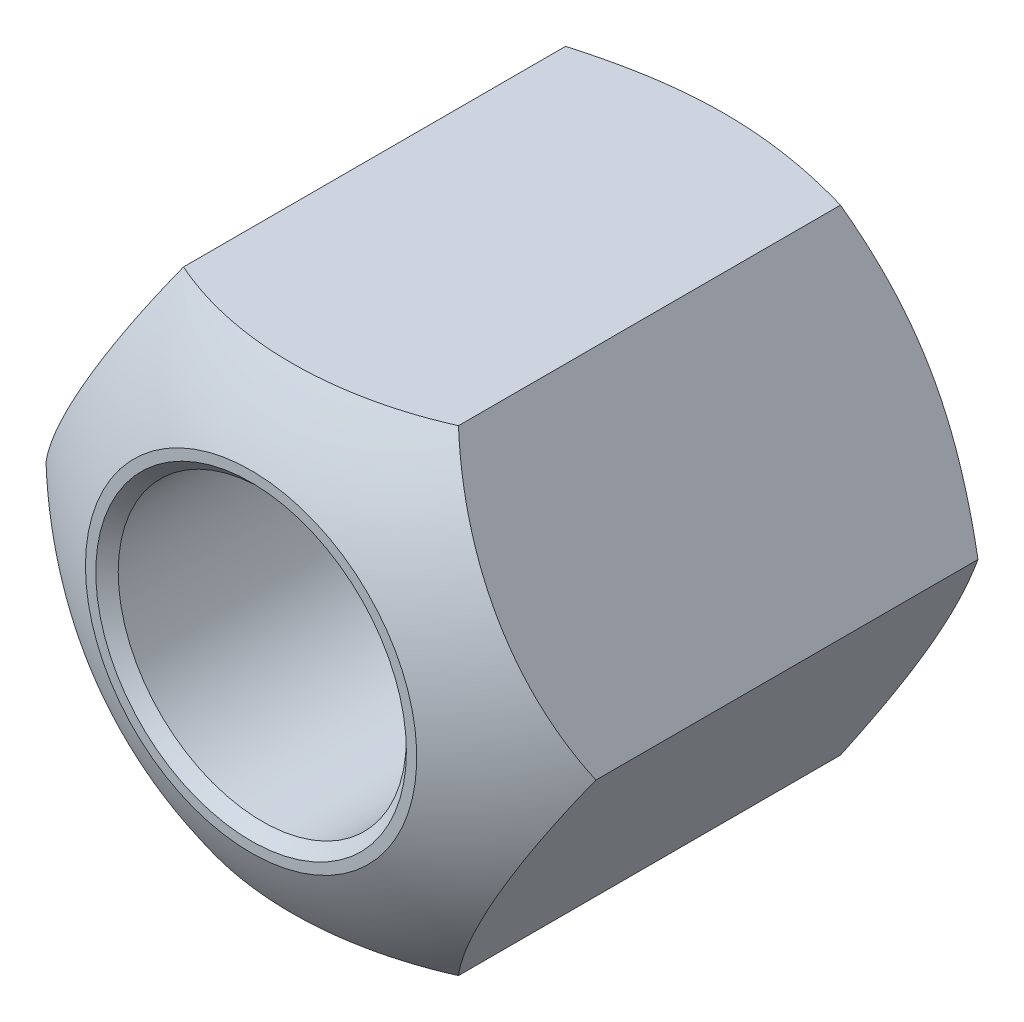
ISO-10303-21;
HEADER;
FILE_DESCRIPTION(('STEP AP214'),'2;1');
FILE_NAME('part.step','',(''),(''),'','','');
FILE_SCHEMA(('AUTOMOTIVE_DESIGN { 1 0 10303 214 1 1 1 1 }'));
ENDSEC;
DATA;
#1=APPLICATION_CONTEXT('core data for automotive mechanical design processes');
#2=APPLICATION_PROTOCOL_DEFINITION('international standard','automotive_design',2000,#1);
#3=PRODUCT_CONTEXT('',#1,'mechanical');
#4=PRODUCT('Part','Part','',(#3));
#5=PRODUCT_RELATED_PRODUCT_CATEGORY('part','',(#4));
#6=PRODUCT_DEFINITION_FORMATION('','',#4);
#7=PRODUCT_DEFINITION_CONTEXT('part definition',#1,'design');
#8=PRODUCT_DEFINITION('design','',#6,#7);
#9=PRODUCT_DEFINITION_SHAPE('','',#8);
#10=(LENGTH_UNIT() NAMED_UNIT(*) SI_UNIT(.MILLI.,.METRE.));
#11=(NAMED_UNIT(*) PLANE_ANGLE_UNIT() SI_UNIT($,.RADIAN.));
#12=(NAMED_UNIT(*) SI_UNIT($,.STERADIAN.) SOLID_ANGLE_UNIT());
#13=UNCERTAINTY_MEASURE_WITH_UNIT(LENGTH_MEASURE(1.E-05),#10,'distance_accuracy_value','');
#14=(GEOMETRIC_REPRESENTATION_CONTEXT(3) GLOBAL_UNCERTAINTY_ASSIGNED_CONTEXT((#13)) GLOBAL_UNIT_ASSIGNED_CONTEXT((#10,
#11,#12)) REPRESENTATION_CONTEXT('',''));
#15=CARTESIAN_POINT('',(0.,0.,0.));
#16=DIRECTION('',(0.,0.,1.));
#17=DIRECTION('',(1.,0.,0.));
#18=AXIS2_PLACEMENT_3D('',#15,#16,#17);
#19=CARTESIAN_POINT('',(-21.8115060802935,-0.688312552473345,-34.1728118765488));
#20=DIRECTION('',(0.,-1.,0.));
#21=DIRECTION('',(1.,0.,0.));
#22=AXIS2_PLACEMENT_3D('',#19,#20,#21);
#23=PLANE('',#22);
#24=CARTESIAN_POINT('',(-43.364174180659,-0.688312552473348,-20.5573968527933));
#25=CARTESIAN_POINT('',(-42.8652113743147,-0.688312552473348,-20.7977856170871));
#26=CARTESIAN_POINT('',(-42.365639392221,-0.688312552473348,-21.0369138297615));
#27=CARTESIAN_POINT('',(-41.3651505367829,-0.688312552473347,-21.5123537705534));
#28=CARTESIAN_POINT('',(-40.864233648564,-0.688312552473347,-21.748665467362));
#29=CARTESIAN_POINT('',(-39.8608547248779,-0.688312552473347,-22.2182113228665));
#30=CARTESIAN_POINT('',(-39.3583924425456,-0.688312552473347,-22.4514449546127));
#31=CARTESIAN_POINT('',(-38.3518723567875,-0.688312552473347,-22.9144375778677));
#32=CARTESIAN_POINT('',(-37.8478145574252,-0.688312552473347,-23.1441965782171));
#33=CARTESIAN_POINT('',(-36.3270820973135,-0.688312552473347,-23.8303672213714));
#34=CARTESIAN_POINT('',(-35.307742211604,-0.688312552473347,-24.2809036143607));
#35=CARTESIAN_POINT('',(-33.2606617087179,-0.688312552473346,-25.1623890799576));
#36=CARTESIAN_POINT('',(-32.2329215184432,-0.688312552473346,-25.5933391407261));
#37=CARTESIAN_POINT('',(-30.1378622822358,-0.688312552473346,-26.4424052095412));
#38=CARTESIAN_POINT('',(-29.0702508397684,-0.688312552473346,-26.8598037992115));
#39=CARTESIAN_POINT('',(-26.9222255315434,-0.688312552473345,-27.6609348711898));
#40=CARTESIAN_POINT('',(-25.8418102028342,-0.688312552473345,-28.0446634634901));
#41=CARTESIAN_POINT('',(-23.6688028539271,-0.688312552473345,-28.7677587165208));
#42=CARTESIAN_POINT('',(-22.5762435778769,-0.688312552473345,-29.1072229410037));
#43=CARTESIAN_POINT('',(-20.375378191733,-0.688312552473345,-29.730365540965));
#44=CARTESIAN_POINT('',(-19.2670774292805,-0.688312552473345,-30.0140623974526));
#45=CARTESIAN_POINT('',(-17.5956567621693,-0.688312552473345,-30.3863712928532));
#46=CARTESIAN_POINT('',(-17.0383765653784,-0.688312552473344,-30.5013876864848));
#47=CARTESIAN_POINT('',(-15.9201767824307,-0.688312552473344,-30.7122181626514));
#48=CARTESIAN_POINT('',(-15.3592572807741,-0.688312552473344,-30.8080326893949));
#49=CARTESIAN_POINT('',(-14.2342331896336,-0.688312552473344,-30.9787205891411));
#50=CARTESIAN_POINT('',(-13.6701286453774,-0.688312552473344,-31.0535942587462));
#51=CARTESIAN_POINT('',(-12.5393731276811,-0.688312552473344,-31.1808839300267));
#52=CARTESIAN_POINT('',(-11.972722153663,-0.688312552473344,-31.2332999266042));
#53=CARTESIAN_POINT('',(-10.8447196373537,-0.688312552473343,-31.3140153049642));
#54=CARTESIAN_POINT('',(-10.2833889333685,-0.688312552473343,-31.3426041626038));
#55=CARTESIAN_POINT('',(-9.16002537541743,-0.688312552473343,-31.3760947272865));
#56=CARTESIAN_POINT('',(-8.59799253245408,-0.688312552473343,-31.3809968009577));
#57=CARTESIAN_POINT('',(-7.47421005167185,-0.688312552473343,-31.3669977330455));
#58=CARTESIAN_POINT('',(-6.91246042029308,-0.688312552473343,-31.3480960726179));
#59=CARTESIAN_POINT('',(-5.79023043645902,-0.688312552473342,-31.2869327019772));
#60=CARTESIAN_POINT('',(-5.2297501428274,-0.688312552473342,-31.2446699305395));
#61=CARTESIAN_POINT('',(-3.85648688809357,-0.688312552473341,-31.1133597620753));
#62=CARTESIAN_POINT('',(-3.04488356588829,-0.688312552473342,-31.0117766250623));
#63=CARTESIAN_POINT('',(-1.42826125427573,-0.688312552473343,-30.7653708396185));
#64=CARTESIAN_POINT('',(-0.623243291699076,-0.688312552473342,-30.6205415752084));
#65=CARTESIAN_POINT('',(0.979633130866239,-0.688312552473342,-30.2927973904908));
#66=CARTESIAN_POINT('',(1.77748500014387,-0.688312552473342,-30.1098505417129));
#67=CARTESIAN_POINT('',(3.36492225633583,-0.688312552473342,-29.7113989462334));
#68=CARTESIAN_POINT('',(4.15450782311018,-0.688312552473341,-29.4958949094991));
#69=CARTESIAN_POINT('',(5.74256547663509,-0.688312552473341,-29.032483191192));
#70=CARTESIAN_POINT('',(6.54086159547079,-0.688312552473341,-28.7839765692017));
#71=CARTESIAN_POINT('',(8.12958725211722,-0.688312552473341,-28.2630985644782));
#72=CARTESIAN_POINT('',(8.92001673868503,-0.688312552473341,-27.9907270264031));
#73=CARTESIAN_POINT('',(10.4934330053447,-0.68831255247334,-27.4262835671693));
#74=CARTESIAN_POINT('',(11.2764225429129,-0.68831255247334,-27.1342192978254));
#75=CARTESIAN_POINT('',(12.8360355582879,-0.688312552473341,-26.5336475193339));
#76=CARTESIAN_POINT('',(13.6126590985965,-0.688312552473341,-26.2251401718491));
#77=CARTESIAN_POINT('',(15.3933886161045,-0.688312552473341,-25.4994542606817));
#78=CARTESIAN_POINT('',(16.3955579639846,-0.68831255247334,-25.0775314939519));
#79=CARTESIAN_POINT('',(18.3919715603131,-0.688312552473339,-24.2152868962896));
#80=CARTESIAN_POINT('',(19.3862154125716,-0.688312552473339,-23.7749641523388));
#81=CARTESIAN_POINT('',(21.3682028876162,-0.688312552473339,-22.8794878199226));
#82=CARTESIAN_POINT('',(22.3559452982677,-0.688312552473339,-22.4243315550405));
#83=CARTESIAN_POINT('',(24.3258051462865,-0.688312552473339,-21.5020748089487));
#84=CARTESIAN_POINT('',(25.3079226794759,-0.688312552473339,-21.0349745319555));
#85=CARTESIAN_POINT('',(27.2683573418649,-0.688312552473338,-20.0905475664461));
#86=CARTESIAN_POINT('',(28.2466700364004,-0.688312552473338,-19.6132116869644));
#87=CARTESIAN_POINT('',(30.199299364547,-0.688312552473338,-18.6504373400399));
#88=CARTESIAN_POINT('',(31.173615984367,-0.688312552473338,-18.1649988446628));
#89=CARTESIAN_POINT('',(33.1187502942094,-0.688312552473338,-17.1874153083342));
#90=CARTESIAN_POINT('',(34.0895683333116,-0.688312552473337,-16.6952709612984));
#91=CARTESIAN_POINT('',(36.0282942898574,-0.688312552473337,-15.7052923134865));
#92=CARTESIAN_POINT('',(36.9962022117053,-0.688312552473337,-15.2074580213271));
#93=CARTESIAN_POINT('',(39.7438970385037,-0.688312552473337,-13.7855551950312));
#94=CARTESIAN_POINT('',(41.5207050056149,-0.688312552473337,-12.8557299969641));
#95=CARTESIAN_POINT('',(45.0678914056553,-0.688312552473336,-10.9837994905329));
#96=CARTESIAN_POINT('',(46.8382696506688,-0.688312552473336,-10.0416938268934));
#97=CARTESIAN_POINT('',(50.3701704070157,-0.688312552473335,-8.15005058149527));
#98=CARTESIAN_POINT('',(52.1317037639952,-0.688312552473335,-7.20053323648602));
#99=CARTESIAN_POINT('',(54.7709486227348,-0.688312552473335,-5.77072284961265));
#100=CARTESIAN_POINT('',(55.650167434997,-0.688312552473335,-5.29320808868211));
#101=CARTESIAN_POINT('',(57.4076984563106,-0.688312552473334,-4.33651597056777));
#102=CARTESIAN_POINT('',(58.2860106666848,-0.688312552473334,-3.8573386158141));
#103=CARTESIAN_POINT('',(59.1639199338016,-0.688312552473334,-3.37742394748412));
#104=B_SPLINE_CURVE_WITH_KNOTS('',3,(#24,#25,#26,#27,#28,#29,#30,#31,#32,#33,#34,#35,#36,#37,
#38,#39,#40,#41,#42,#43,#44,#45,#46,#47,#48,#49,#50,#51,#52,#53,#54,#55,#56,#57,#58,#59,#60,#61,
#62,#63,#64,#65,#66,#67,#68,#69,#70,#71,#72,#73,#74,#75,#76,#77,#78,#79,#80,#81,#82,#83,#84,#85,
#86,#87,#88,#89,#90,#91,#92,#93,#94,#95,#96,#97,#98,#99,#100,#101,#102,#103),.UNSPECIFIED.,.F.,
.F.,(4,2,2,2,2,2,2,2,2,2,2,2,2,2,2,2,2,2,2,2,2,2,2,2,2,2,2,2,2,2,2,2,2,2,2,2,2,2,2,4),(0.,
1.66155281507719,3.32312408307869,4.98497620733311,6.64682410251409,9.99005360036441,
13.3331142394393,16.7715958375406,20.2104741733002,23.6416398713221,27.0716665752149,
28.7784655156213,30.4852249670629,32.1919602430643,33.8986959064849,35.5843810326371,
37.2700400673877,38.9557358446774,40.6415082043157,43.0939400081897,45.5467471880686,
48.0016172350933,50.4564337570437,52.9642283239922,55.4720392159312,57.9788812257284,
60.4856985936385,63.7475477982721,67.0095590505379,70.2721621629904,73.5347095292892,
76.800320503309,80.0659427380144,83.3312295772692,86.5965114721927,92.6126334432224,
98.6289298494208,104.632341948055,107.633909306331,110.635472279181),.UNSPECIFIED.);
#105=CARTESIAN_POINT('',(4.74660630242926,-0.688312552473373,-29.3228118765488));
#106=VERTEX_POINT('',#105);
#107=CARTESIAN_POINT('',(-21.8115060802935,-0.688312552473355,-29.3228118765488));
#108=VERTEX_POINT('',#107);
#109=EDGE_CURVE('E180',#106,#108,#104,.F.);
#110=ORIENTED_EDGE('',*,*,#109,.F.);
#111=DIRECTION('',(0.,0.,1.));
#112=VECTOR('',#111,1.);
#113=CARTESIAN_POINT('',(4.74660630242929,-0.688312552473341,-34.1728118765488));
#114=LINE('',#113,#112);
#115=CARTESIAN_POINT('',(4.74660630242929,-0.688312552473341,7.57756159603723));
#116=VERTEX_POINT('',#115);
#117=EDGE_CURVE('E39',#106,#116,#114,.T.);
#118=ORIENTED_EDGE('',*,*,#117,.T.);
#119=CARTESIAN_POINT('',(-8.53244988893209,-0.688312552473334,-22.3334174361955));
#120=DIRECTION('',(0.,-1.,0.));
#121=DIRECTION('',(1.,0.,0.));
#122=AXIS2_PLACEMENT_3D('',#119,#120,#121);
#123=CIRCLE('',#122,32.7261363439072);
#124=CARTESIAN_POINT('',(-21.8115060802935,-0.688312552473352,7.57756159603724));
#125=VERTEX_POINT('',#124);
#126=EDGE_CURVE('E97',#116,#125,#123,.T.);
#127=ORIENTED_EDGE('',*,*,#126,.T.);
#128=DIRECTION('',(0.,0.,1.));
#129=VECTOR('',#128,1.);
#130=CARTESIAN_POINT('',(-21.8115060802935,-0.688312552473345,-34.1728118765488));
#131=LINE('',#130,#129);
#132=EDGE_CURVE('E102',#108,#125,#131,.T.);
#133=ORIENTED_EDGE('',*,*,#132,.F.);
#134=EDGE_LOOP('',(#110,#118,#127,#133));
#135=FACE_BOUND('',#134,.T.);
#136=ADVANCED_FACE('F16',(#135),#23,.T.);
#137=CARTESIAN_POINT('',(-35.0905622716549,22.3116874475267,-34.1728118765488));
#138=DIRECTION('',(-0.866025403784438,-0.5,0.));
#139=DIRECTION('',(0.5,-0.866025403784439,0.));
#140=AXIS2_PLACEMENT_3D('',#137,#138,#139);
#141=PLANE('',#140);
#142=CARTESIAN_POINT('',(-21.8113906102397,-0.688512552473344,-29.3227452094473));
#143=CARTESIAN_POINT('',(-22.1032585280075,-0.182982489800128,-29.4912430266369));
#144=CARTESIAN_POINT('',(-22.3962648860752,0.324519409313961,-29.6520946268264));
#145=CARTESIAN_POINT('',(-22.9846271619718,1.34359276442373,-29.9563800253422));
#146=CARTESIAN_POINT('',(-23.279983818727,1.85516550027727,-30.0998080950021));
#147=CARTESIAN_POINT('',(-23.8736238120387,2.88338013009803,-30.3673212930186));
#148=CARTESIAN_POINT('',(-24.1719123908864,3.40003110397977,-30.4913602292878));
#149=CARTESIAN_POINT('',(-24.7705495565162,4.43690109014963,-30.717423075732));
#150=CARTESIAN_POINT('',(-25.0708979350049,4.95711974166299,-30.8194491790077));
#151=CARTESIAN_POINT('',(-25.6659775460291,5.98782786250525,-30.9971555015905));
#152=CARTESIAN_POINT('',(-25.9606646384466,6.498240878907,-31.0734233954765));
#153=CARTESIAN_POINT('',(-26.5513891024217,7.5214056637859,-31.2013072654084));
#154=CARTESIAN_POINT('',(-26.8474264998602,8.03415747708978,-31.2529227669311));
#155=CARTESIAN_POINT('',(-27.4399985814096,9.06052242948013,-31.3301985865952));
#156=CARTESIAN_POINT('',(-27.7365322531997,9.57413381517565,-31.3558897469131));
#157=CARTESIAN_POINT('',(-28.329873244251,10.6018305578897,-31.3807644018782));
#158=CARTESIAN_POINT('',(-28.6266805547727,11.1159158997711,-31.3799487156378));
#159=CARTESIAN_POINT('',(-29.1815667256381,12.0770069401274,-31.3536610461216));
#160=CARTESIAN_POINT('',(-29.4396851053547,12.5240810881638,-31.3313946122529));
#161=CARTESIAN_POINT('',(-29.9553056409861,13.4171620533033,-31.2672373268912));
#162=CARTESIAN_POINT('',(-30.2128078056739,13.8631688856016,-31.2253467564764));
#163=CARTESIAN_POINT('',(-30.7271007720538,14.753950433347,-31.1226672065899));
#164=CARTESIAN_POINT('',(-30.9838907177758,15.1987236662103,-31.0618611378166));
#165=CARTESIAN_POINT('',(-31.496241053083,16.0861404782373,-30.9224267569259));
#166=CARTESIAN_POINT('',(-31.7518014478731,16.528784066416,-30.8437985203198));
#167=CARTESIAN_POINT('',(-32.527628386363,17.8725557417612,-30.5791626851964));
#168=CARTESIAN_POINT('',(-33.045690666378,18.7698659322322,-30.3667535262186));
#169=CARTESIAN_POINT('',(-33.8170628620437,20.1059217666712,-30.0051368981283));
#170=CARTESIAN_POINT('',(-34.0730123539674,20.5492392908543,-29.8775610005275));
#171=CARTESIAN_POINT('',(-34.5831409701095,21.4328079724074,-29.6094937184256));
#172=CARTESIAN_POINT('',(-34.8373205717077,21.8730599566231,-29.4690059741789));
#173=CARTESIAN_POINT('',(-35.0906777417087,22.3118874475267,-29.3227452094473));
#174=B_SPLINE_CURVE_WITH_KNOTS('',3,(#142,#143,#144,#145,#146,#147,#148,#149,#150,#151,#152,
#153,#154,#155,#156,#157,#158,#159,#160,#161,#162,#163,#164,#165,#166,#167,#168,#169,#170,#171,
#172,#173),.UNSPECIFIED.,.F.,.F.,(4,2,2,2,2,2,2,2,2,2,2,2,2,2,2,4),(0.,1.82275209583971,
3.64610187987773,5.47373144334343,7.30117883905958,9.08355891739022,10.8659733025976,
12.6462646412199,14.4265009654718,15.9762768881921,17.5260306140232,19.0771885590146,
20.6283399319781,23.7989683744784,25.381520854309,26.9636285236953),.UNSPECIFIED.);
#175=CARTESIAN_POINT('',(-35.0905622716549,22.3116874475267,-29.3228118765488));
#176=VERTEX_POINT('',#175);
#177=EDGE_CURVE('E172',#108,#176,#174,.T.);
#178=ORIENTED_EDGE('',*,*,#177,.F.);
#179=ORIENTED_EDGE('',*,*,#132,.T.);
#180=CARTESIAN_POINT('',(-28.4510341759742,10.8116874475266,-22.3334174361955));
#181=DIRECTION('',(-0.866025403784438,-0.5,0.));
#182=DIRECTION('',(0.5,-0.866025403784439,0.));
#183=AXIS2_PLACEMENT_3D('',#180,#181,#182);
#184=CIRCLE('',#183,32.7261363439071);
#185=CARTESIAN_POINT('',(-35.0905622716549,22.3116874475267,7.57756159603724));
#186=VERTEX_POINT('',#185);
#187=EDGE_CURVE('E225',#125,#186,#184,.T.);
#188=ORIENTED_EDGE('',*,*,#187,.T.);
#189=DIRECTION('',(0.,0.,1.));
#190=VECTOR('',#189,1.);
#191=CARTESIAN_POINT('',(-35.0905622716549,22.3116874475267,-34.1728118765488));
#192=LINE('',#191,#190);
#193=EDGE_CURVE('E91',#176,#186,#192,.T.);
#194=ORIENTED_EDGE('',*,*,#193,.F.);
#195=EDGE_LOOP('',(#178,#179,#188,#194));
#196=FACE_BOUND('',#195,.T.);
#197=ADVANCED_FACE('F182',(#196),#141,.T.);
#198=CARTESIAN_POINT('',(-21.8115060802935,45.3116874475267,-34.1728118765488));
#199=DIRECTION('',(-0.866025403784439,0.5,0.));
#200=DIRECTION('',(-0.5,-0.866025403784439,0.));
#201=AXIS2_PLACEMENT_3D('',#198,#199,#200);
#202=PLANE('',#201);
#203=CARTESIAN_POINT('',(-35.0906777417087,22.3114874475267,-29.3227452094473));
#204=CARTESIAN_POINT('',(-34.7988098239409,22.8170175101999,-29.4912430266369));
#205=CARTESIAN_POINT('',(-34.5058034658731,23.324519409314,-29.6520946268264));
#206=CARTESIAN_POINT('',(-33.9174411899765,24.3435927644237,-29.9563800253422));
#207=CARTESIAN_POINT('',(-33.6220845332214,24.8551655002773,-30.0998080950021));
#208=CARTESIAN_POINT('',(-33.0284445399097,25.883380130098,-30.3673212930186));
#209=CARTESIAN_POINT('',(-32.730155961062,26.4000311039798,-30.4913602292878));
#210=CARTESIAN_POINT('',(-32.1315187954322,27.4369010901496,-30.717423075732));
#211=CARTESIAN_POINT('',(-31.8311704169435,27.957119741663,-30.8194491790077));
#212=CARTESIAN_POINT('',(-31.2360908059193,28.9878278625053,-30.9971555015905));
#213=CARTESIAN_POINT('',(-30.9414037135018,29.498240878907,-31.0734233954765));
#214=CARTESIAN_POINT('',(-30.3506792495266,30.5214056637859,-31.2013072654084));
#215=CARTESIAN_POINT('',(-30.0546418520882,31.0341574770898,-31.2529227669311));
#216=CARTESIAN_POINT('',(-29.4620697705388,32.0605224294801,-31.3301985865952));
#217=CARTESIAN_POINT('',(-29.1655360987486,32.5741338151756,-31.3558897469131));
#218=CARTESIAN_POINT('',(-28.5721951076974,33.6018305578897,-31.3807644018782));
#219=CARTESIAN_POINT('',(-28.2753877971757,34.1159158997711,-31.3799487156378));
#220=CARTESIAN_POINT('',(-27.7205016263103,35.0770069401274,-31.3536610461216));
#221=CARTESIAN_POINT('',(-27.4623832465937,35.5240810881638,-31.3313946122529));
#222=CARTESIAN_POINT('',(-26.9467627109623,36.4171620533033,-31.2672373268912));
#223=CARTESIAN_POINT('',(-26.6892605462745,36.8631688856016,-31.2253467564764));
#224=CARTESIAN_POINT('',(-26.1749675798945,37.753950433347,-31.1226672065899));
#225=CARTESIAN_POINT('',(-25.9181776341726,38.1987236662103,-31.0618611378166));
#226=CARTESIAN_POINT('',(-25.4058272988654,39.0861404782373,-30.9224267569259));
#227=CARTESIAN_POINT('',(-25.1502669040753,39.528784066416,-30.8437985203198));
#228=CARTESIAN_POINT('',(-24.3744399655854,40.8725557417612,-30.5791626851964));
#229=CARTESIAN_POINT('',(-23.8563776855703,41.7698659322322,-30.3667535262186));
#230=CARTESIAN_POINT('',(-23.0850054899046,43.1059217666712,-30.0051368981283));
#231=CARTESIAN_POINT('',(-22.829055997981,43.5492392908543,-29.8775610005275));
#232=CARTESIAN_POINT('',(-22.3189273818389,44.4328079724073,-29.6094937184256));
#233=CARTESIAN_POINT('',(-22.0647477802406,44.8730599566231,-29.4690059741789));
#234=CARTESIAN_POINT('',(-21.8113906102397,45.3118874475267,-29.3227452094473));
#235=B_SPLINE_CURVE_WITH_KNOTS('',3,(#203,#204,#205,#206,#207,#208,#209,#210,#211,#212,#213,
#214,#215,#216,#217,#218,#219,#220,#221,#222,#223,#224,#225,#226,#227,#228,#229,#230,#231,#232,
#233,#234),.UNSPECIFIED.,.F.,.F.,(4,2,2,2,2,2,2,2,2,2,2,2,2,2,2,4),(0.,1.82275209583971,
3.64610187987774,5.47373144334343,7.30117883905958,9.08355891739021,10.8659733025976,
12.6462646412199,14.4265009654718,15.9762768881921,17.5260306140232,19.0771885590146,
20.6283399319781,23.7989683744784,25.381520854309,26.9636285236953),.UNSPECIFIED.);
#236=CARTESIAN_POINT('',(-21.8115060802935,45.3116874475266,-29.3228118765488));
#237=VERTEX_POINT('',#236);
#238=EDGE_CURVE('E73',#176,#237,#235,.T.);
#239=ORIENTED_EDGE('',*,*,#238,.F.);
#240=ORIENTED_EDGE('',*,*,#193,.T.);
#241=CARTESIAN_POINT('',(-28.4510341759742,33.8116874475267,-22.3334174361955));
#242=DIRECTION('',(-0.866025403784439,0.5,0.));
#243=DIRECTION('',(-0.5,-0.866025403784439,0.));
#244=AXIS2_PLACEMENT_3D('',#241,#242,#243);
#245=CIRCLE('',#244,32.7261363439071);
#246=CARTESIAN_POINT('',(-21.8115060802935,45.3116874475266,7.57756159603724));
#247=VERTEX_POINT('',#246);
#248=EDGE_CURVE('E218',#186,#247,#245,.T.);
#249=ORIENTED_EDGE('',*,*,#248,.T.);
#250=DIRECTION('',(0.,0.,1.));
#251=VECTOR('',#250,1.);
#252=CARTESIAN_POINT('',(-21.8115060802935,45.3116874475267,-34.1728118765488));
#253=LINE('',#252,#251);
#254=EDGE_CURVE('E93',#237,#247,#253,.T.);
#255=ORIENTED_EDGE('',*,*,#254,.F.);
#256=EDGE_LOOP('',(#239,#240,#249,#255));
#257=FACE_BOUND('',#256,.T.);
#258=ADVANCED_FACE('F187',(#257),#202,.T.);
#259=CARTESIAN_POINT('',(4.74660630242929,45.3116874475267,-34.1728118765488));
#260=DIRECTION('',(0.,1.,0.));
#261=DIRECTION('',(0.,0.,1.));
#262=AXIS2_PLACEMENT_3D('',#259,#260,#261);
#263=PLANE('',#262);
#264=CARTESIAN_POINT('',(-43.3641741798055,45.3116874475267,-20.5573968532045));
#265=CARTESIAN_POINT('',(-42.8652113734755,45.3116874475267,-20.7977856174896));
#266=CARTESIAN_POINT('',(-42.3656393913961,45.3116874475267,-21.0369138301554));
#267=CARTESIAN_POINT('',(-41.3651505359867,45.3116874475267,-21.51235377093));
#268=CARTESIAN_POINT('',(-40.864233647782,45.3116874475267,-21.7486654677299));
#269=CARTESIAN_POINT('',(-39.8608547241247,45.3116874475267,-22.218211323217));
#270=CARTESIAN_POINT('',(-39.3583924418067,45.3116874475267,-22.4514449549547));
#271=CARTESIAN_POINT('',(-38.3518723560773,45.3116874475267,-22.9144375781923));
#272=CARTESIAN_POINT('',(-37.8478145567294,45.3116874475267,-23.1441965785331));
#273=CARTESIAN_POINT('',(-36.3270820966613,45.3116874475267,-23.8303672216615));
#274=CARTESIAN_POINT('',(-35.3077422109809,45.3116874475267,-24.2809036146335));
#275=CARTESIAN_POINT('',(-33.2606617081535,45.3116874475267,-25.1623890801961));
#276=CARTESIAN_POINT('',(-32.2329215179082,45.3116874475267,-25.5933391409476));
#277=CARTESIAN_POINT('',(-30.1378622817616,45.3116874475267,-26.4424052097285));
#278=CARTESIAN_POINT('',(-29.0702508393254,45.3116874475267,-26.8598037993817));
#279=CARTESIAN_POINT('',(-26.9222255311635,45.3116874475267,-27.6609348713266));
#280=CARTESIAN_POINT('',(-25.8418102024861,45.3116874475267,-28.0446634636107));
#281=CARTESIAN_POINT('',(-23.6688028536432,45.3116874475267,-28.7677587166106));
#282=CARTESIAN_POINT('',(-22.5762435776255,45.3116874475267,-29.1072229410789));
#283=CARTESIAN_POINT('',(-20.3753781915473,45.3116874475267,-29.7303655410136));
#284=CARTESIAN_POINT('',(-19.2670774291281,45.3116874475267,-30.0140623974891));
#285=CARTESIAN_POINT('',(-17.5956567620763,45.3116874475267,-30.3863712928727));
#286=CARTESIAN_POINT('',(-17.038376565311,45.3116874475267,-30.501387686498));
#287=CARTESIAN_POINT('',(-15.920176782415,45.3116874475267,-30.7122181626539));
#288=CARTESIAN_POINT('',(-15.3592572807844,45.3116874475267,-30.8080326893929));
#289=CARTESIAN_POINT('',(-14.2342331896962,45.3116874475267,-30.9787205891321));
#290=CARTESIAN_POINT('',(-13.6701286454663,45.3116874475267,-31.0535942587347));
#291=CARTESIAN_POINT('',(-12.5393731278227,45.3116874475267,-31.1808839300123));
#292=CARTESIAN_POINT('',(-11.9727221538311,45.3116874475267,-31.2332999265895));
#293=CARTESIAN_POINT('',(-10.8447196375742,45.3116874475267,-31.3140153049511));
#294=CARTESIAN_POINT('',(-10.2833889336149,45.3116874475267,-31.3426041625926));
#295=CARTESIAN_POINT('',(-9.16002537571558,45.3116874475267,-31.3760947272815));
#296=CARTESIAN_POINT('',(-8.59799253277806,45.3116874475267,-31.3809968009568));
#297=CARTESIAN_POINT('',(-7.47421005204728,45.3116874475267,-31.366997733055));
#298=CARTESIAN_POINT('',(-6.91246042069412,45.3116874475267,-31.3480960726338));
#299=CARTESIAN_POINT('',(-5.79023043691093,45.3116874475267,-31.2869327020077));
#300=CARTESIAN_POINT('',(-5.22975014330457,45.3116874475267,-31.2446699305784));
#301=CARTESIAN_POINT('',(-3.85648688861155,45.3116874475267,-31.1133597621347));
#302=CARTESIAN_POINT('',(-3.04488356642171,45.3116874475267,-31.0117766251336));
#303=CARTESIAN_POINT('',(-1.42826125483938,45.3116874475267,-30.7653708397144));
#304=CARTESIAN_POINT('',(-0.623243292277516,45.3116874475267,-30.6205415753169));
#305=CARTESIAN_POINT('',(0.9796331302587,45.3116874475267,-30.2927973906248));
#306=CARTESIAN_POINT('',(1.77748499952203,45.3116874475267,-30.1098505418598));
#307=CARTESIAN_POINT('',(3.36492225568575,45.3116874475267,-29.7113989464059));
#308=CARTESIAN_POINT('',(4.15450782244615,45.3116874475267,-29.4958949096843));
#309=CARTESIAN_POINT('',(5.74256547594284,45.3116874475267,-29.0324831914027));
#310=CARTESIAN_POINT('',(6.54086159476426,45.3116874475267,-28.7839765694253));
#311=CARTESIAN_POINT('',(8.12958725138228,45.3116874475267,-28.2630985647272));
#312=CARTESIAN_POINT('',(8.92001673793595,45.3116874475267,-27.9907270266646));
#313=CARTESIAN_POINT('',(10.4934330045675,45.3116874475267,-27.4262835674554));
#314=CARTESIAN_POINT('',(11.2764225421216,45.3116874475267,-27.1342192981236));
#315=CARTESIAN_POINT('',(12.8360355574684,45.3116874475267,-26.5336475196559));
#316=CARTESIAN_POINT('',(13.6126590977629,45.3116874475267,-26.2251401721829));
#317=CARTESIAN_POINT('',(15.3933886152607,45.3116874475267,-25.4994542610332));
#318=CARTESIAN_POINT('',(16.3955579631444,45.3116874475267,-25.0775314943086));
#319=CARTESIAN_POINT('',(18.3919715594796,45.3116874475267,-24.2152868966557));
#320=CARTESIAN_POINT('',(19.3862154117413,45.3116874475267,-23.7749641527089));
#321=CARTESIAN_POINT('',(21.3682028867919,45.3116874475267,-22.8794878203));
#322=CARTESIAN_POINT('',(22.3559452974463,45.3116874475267,-22.424331555421));
#323=CARTESIAN_POINT('',(24.3258051454705,45.3116874475267,-21.5020748093348));
#324=CARTESIAN_POINT('',(25.3079226786625,45.3116874475267,-21.034974532344));
#325=CARTESIAN_POINT('',(27.2683573410565,45.3116874475267,-20.0905475668388));
#326=CARTESIAN_POINT('',(28.2466700355945,45.3116874475267,-19.613211687359));
#327=CARTESIAN_POINT('',(30.1992993637458,45.3116874475267,-18.6504373404377));
#328=CARTESIAN_POINT('',(31.173615983568,45.3116874475267,-18.164998845062));
#329=CARTESIAN_POINT('',(33.1187502934147,45.3116874475267,-17.1874153087359));
#330=CARTESIAN_POINT('',(34.089568332519,45.3116874475267,-16.6952709617012));
#331=CARTESIAN_POINT('',(36.0282942890689,45.3116874475267,-15.7052923138911));
#332=CARTESIAN_POINT('',(36.9962022109186,45.3116874475267,-15.2074580217326));
#333=CARTESIAN_POINT('',(39.7438970377195,45.3116874475267,-13.78555519544));
#334=CARTESIAN_POINT('',(41.5207050048312,45.3116874475267,-12.8557299973753));
#335=CARTESIAN_POINT('',(45.0678914048722,45.3116874475267,-10.9837994909485));
#336=CARTESIAN_POINT('',(46.8382696498859,45.3116874475267,-10.0416938273109));
#337=CARTESIAN_POINT('',(50.3701704062325,45.3116874475267,-8.15005058191652));
#338=CARTESIAN_POINT('',(52.1317037632117,45.3116874475267,-7.20053323690908));
#339=CARTESIAN_POINT('',(54.7709486219506,45.3116874475267,-5.77072285003822));
#340=CARTESIAN_POINT('',(55.6501674342125,45.3116874475267,-5.29320808910849));
#341=CARTESIAN_POINT('',(57.4076984555256,45.3116874475267,-4.33651597099571));
#342=CARTESIAN_POINT('',(58.2860106658995,45.3116874475267,-3.85733861624281));
#343=CARTESIAN_POINT('',(59.163919933016,45.3116874475267,-3.37742394791358));
#344=B_SPLINE_CURVE_WITH_KNOTS('',3,(#264,#265,#266,#267,#268,#269,#270,#271,#272,#273,#274,
#275,#276,#277,#278,#279,#280,#281,#282,#283,#284,#285,#286,#287,#288,#289,#290,#291,#292,#293,
#294,#295,#296,#297,#298,#299,#300,#301,#302,#303,#304,#305,#306,#307,#308,#309,#310,#311,#312,
#313,#314,#315,#316,#317,#318,#319,#320,#321,#322,#323,#324,#325,#326,#327,#328,#329,#330,#331,
#332,#333,#334,#335,#336,#337,#338,#339,#340,#341,#342,#343),.UNSPECIFIED.,.F.,.F.,(4,2,2,2,2,2,
2,2,2,2,2,2,2,2,2,2,2,2,2,2,2,2,2,2,2,2,2,2,2,2,2,2,2,2,2,2,2,2,2,4),(0.,1.66155281502723,
3.32312408297878,4.98497620718323,6.64682410231425,9.99005360006343,13.3331142390372,
16.7715958370323,20.2104741726857,23.6416398706019,27.071666574389,28.7784655147162,
30.4852249660787,32.191960242001,33.8986959053425,35.5843810314174,37.2700400660907,
38.955735843303,40.6415082028639,43.0939400066876,45.5467471865162,48.0016172334903,
50.4564337553903,52.9642283222865,55.4720392141731,57.9788812239181,60.485698591776,
63.7475477964133,67.0095590486829,70.2721621611391,73.5347095274418,76.8003205014658,
80.0659427361753,83.3312295754342,86.5965114703618,92.6126334413893,98.6289298475855,
104.632341946216,107.63390930449,110.635472277339),.UNSPECIFIED.);
#345=CARTESIAN_POINT('',(4.74660630242929,45.3116874475267,-29.3228118765488));
#346=VERTEX_POINT('',#345);
#347=EDGE_CURVE('E68',#237,#346,#344,.T.);
#348=ORIENTED_EDGE('',*,*,#347,.F.);
#349=ORIENTED_EDGE('',*,*,#254,.T.);
#350=CARTESIAN_POINT('',(-8.53244988893209,45.3116874475266,-22.3334174361955));
#351=DIRECTION('',(0.,1.,0.));
#352=DIRECTION('',(0.,0.,1.));
#353=AXIS2_PLACEMENT_3D('',#350,#351,#352);
#354=CIRCLE('',#353,32.7261363439072);
#355=CARTESIAN_POINT('',(4.74660630242929,45.3116874475267,7.57756159603724));
#356=VERTEX_POINT('',#355);
#357=EDGE_CURVE('E89',#247,#356,#354,.T.);
#358=ORIENTED_EDGE('',*,*,#357,.T.);
#359=DIRECTION('',(0.,0.,1.));
#360=VECTOR('',#359,1.);
#361=CARTESIAN_POINT('',(4.74660630242929,45.3116874475267,-34.1728118765488));
#362=LINE('',#361,#360);
#363=EDGE_CURVE('E85',#346,#356,#362,.T.);
#364=ORIENTED_EDGE('',*,*,#363,.F.);
#365=EDGE_LOOP('',(#348,#349,#358,#364));
#366=FACE_BOUND('',#365,.T.);
#367=ADVANCED_FACE('F86',(#366),#263,.T.);
#368=CARTESIAN_POINT('',(18.0256624937907,22.3116874475267,-34.1728118765488));
#369=DIRECTION('',(0.866025403784438,0.5,0.));
#370=DIRECTION('',(-0.5,0.866025403784438,0.));
#371=AXIS2_PLACEMENT_3D('',#368,#369,#370);
#372=PLANE('',#371);
#373=CARTESIAN_POINT('',(4.74649083237545,45.3118874475267,-29.3227452094473));
#374=CARTESIAN_POINT('',(5.03835875014328,44.8063573848534,-29.4912430266369));
#375=CARTESIAN_POINT('',(5.33136510821105,44.2988554857394,-29.6520946268264));
#376=CARTESIAN_POINT('',(5.91972738410765,43.2797821306296,-29.9563800253422));
#377=CARTESIAN_POINT('',(6.21508404086277,42.768209394776,-30.0998080950021));
#378=CARTESIAN_POINT('',(6.80872403417449,41.7399947649553,-30.3673212930186));
#379=CARTESIAN_POINT('',(7.1070126130222,41.2233437910735,-30.4913602292878));
#380=CARTESIAN_POINT('',(7.70564977865201,40.1864738049037,-30.717423075732));
#381=CARTESIAN_POINT('',(8.00599815714072,39.6662551533903,-30.8194491790077));
#382=CARTESIAN_POINT('',(8.60107776816493,38.6355470325481,-30.9971555015905));
#383=CARTESIAN_POINT('',(8.89576486058236,38.1251340161463,-31.0734233954765));
#384=CARTESIAN_POINT('',(9.48648932455754,37.1019692312674,-31.2013072654084));
#385=CARTESIAN_POINT('',(9.78252672199601,36.5892174179635,-31.2529227669311));
#386=CARTESIAN_POINT('',(10.3750988035454,35.5628524655732,-31.3301985865952));
#387=CARTESIAN_POINT('',(10.6716324753355,35.0492410798777,-31.3558897469131));
#388=CARTESIAN_POINT('',(11.2649734663868,34.0215443371636,-31.3807644018782));
#389=CARTESIAN_POINT('',(11.5617807769085,33.5074589952822,-31.3799487156378));
#390=CARTESIAN_POINT('',(12.1166669477739,32.5463679549259,-31.3536610461216));
#391=CARTESIAN_POINT('',(12.3747853274905,32.0992938068895,-31.3313946122529));
#392=CARTESIAN_POINT('',(12.8904058631219,31.20621284175,-31.2672373268912));
#393=CARTESIAN_POINT('',(13.1479080278097,30.7602060094517,-31.2253467564764));
#394=CARTESIAN_POINT('',(13.6622009941896,29.8694244617064,-31.1226672065899));
#395=CARTESIAN_POINT('',(13.9189909399116,29.4246512288431,-31.0618611378166));
#396=CARTESIAN_POINT('',(14.4313412752188,28.537234416816,-30.9224267569259));
#397=CARTESIAN_POINT('',(14.6869016700089,28.0945908286373,-30.8437985203198));
#398=CARTESIAN_POINT('',(15.4627286084988,26.7508191532921,-30.5791626851964));
#399=CARTESIAN_POINT('',(15.9807908885138,25.8535089628211,-30.3667535262186));
#400=CARTESIAN_POINT('',(16.7521630841796,24.5174531283821,-30.0051368981283));
#401=CARTESIAN_POINT('',(17.0081125761032,24.074135604199,-29.8775610005275));
#402=CARTESIAN_POINT('',(17.5182411922453,23.190566922646,-29.6094937184256));
#403=CARTESIAN_POINT('',(17.7724207938435,22.7503149384303,-29.4690059741789));
#404=CARTESIAN_POINT('',(18.0257779638445,22.3114874475267,-29.3227452094473));
#405=B_SPLINE_CURVE_WITH_KNOTS('',3,(#373,#374,#375,#376,#377,#378,#379,#380,#381,#382,#383,
#384,#385,#386,#387,#388,#389,#390,#391,#392,#393,#394,#395,#396,#397,#398,#399,#400,#401,#402,
#403,#404),.UNSPECIFIED.,.F.,.F.,(4,2,2,2,2,2,2,2,2,2,2,2,2,2,2,4),(0.,1.82275209583971,
3.64610187987773,5.47373144334344,7.30117883905958,9.08355891739021,10.8659733025976,
12.6462646412199,14.4265009654718,15.9762768881921,17.5260306140232,19.0771885590146,
20.6283399319781,23.7989683744784,25.381520854309,26.9636285236953),.UNSPECIFIED.);
#406=CARTESIAN_POINT('',(18.0256624937907,22.3116874475267,-29.3228118765488));
#407=VERTEX_POINT('',#406);
#408=EDGE_CURVE('E33',#346,#407,#405,.T.);
#409=ORIENTED_EDGE('',*,*,#408,.F.);
#410=ORIENTED_EDGE('',*,*,#363,.T.);
#411=CARTESIAN_POINT('',(11.38613439811,33.8116874475267,-22.3334174361955));
#412=DIRECTION('',(0.866025403784438,0.5,0.));
#413=DIRECTION('',(-0.5,0.866025403784438,0.));
#414=AXIS2_PLACEMENT_3D('',#411,#412,#413);
#415=CIRCLE('',#414,32.7261363439071);
#416=CARTESIAN_POINT('',(18.0256624937907,22.3116874475267,7.57756159603724));
#417=VERTEX_POINT('',#416);
#418=EDGE_CURVE('E213',#356,#417,#415,.T.);
#419=ORIENTED_EDGE('',*,*,#418,.T.);
#420=DIRECTION('',(0.,0.,1.));
#421=VECTOR('',#420,1.);
#422=CARTESIAN_POINT('',(18.0256624937907,22.3116874475267,-34.1728118765488));
#423=LINE('',#422,#421);
#424=EDGE_CURVE('E81',#407,#417,#423,.T.);
#425=ORIENTED_EDGE('',*,*,#424,.F.);
#426=EDGE_LOOP('',(#409,#410,#419,#425));
#427=FACE_BOUND('',#426,.T.);
#428=ADVANCED_FACE('F79',(#427),#372,.T.);
#429=CARTESIAN_POINT('',(4.74660630242929,-0.688312552473341,-34.1728118765488));
#430=DIRECTION('',(0.866025403784439,-0.5,0.));
#431=DIRECTION('',(0.5,0.866025403784439,0.));
#432=AXIS2_PLACEMENT_3D('',#429,#430,#431);
#433=PLANE('',#432);
#434=CARTESIAN_POINT('',(18.0257779638445,22.3118874475267,-29.3227452094473));
#435=CARTESIAN_POINT('',(17.7339100460767,21.8063573848534,-29.4912430266369));
#436=CARTESIAN_POINT('',(17.4409036880089,21.2988554857394,-29.6520946268264));
#437=CARTESIAN_POINT('',(16.8525414121123,20.2797821306296,-29.9563800253422));
#438=CARTESIAN_POINT('',(16.5571847553572,19.768209394776,-30.0998080950021));
#439=CARTESIAN_POINT('',(15.9635447620455,18.7399947649553,-30.3673212930187));
#440=CARTESIAN_POINT('',(15.6652561831978,18.2233437910735,-30.4913602292878));
#441=CARTESIAN_POINT('',(15.066619017568,17.1864738049037,-30.717423075732));
#442=CARTESIAN_POINT('',(14.7662706390793,16.6662551533903,-30.8194491790077));
#443=CARTESIAN_POINT('',(14.1711910280551,15.6355470325481,-30.9971555015905));
#444=CARTESIAN_POINT('',(13.8765039356376,15.1251340161463,-31.0734233954765));
#445=CARTESIAN_POINT('',(13.2857794716624,14.1019692312674,-31.2013072654084));
#446=CARTESIAN_POINT('',(12.989742074224,13.5892174179635,-31.2529227669312));
#447=CARTESIAN_POINT('',(12.3971699926746,12.5628524655732,-31.3301985865952));
#448=CARTESIAN_POINT('',(12.1006363208844,12.0492410798777,-31.3558897469131));
#449=CARTESIAN_POINT('',(11.5072953298332,11.0215443371636,-31.3807644018782));
#450=CARTESIAN_POINT('',(11.2104880193115,10.5074589952822,-31.3799487156378));
#451=CARTESIAN_POINT('',(10.6556018484461,9.5463679549259,-31.3536610461217));
#452=CARTESIAN_POINT('',(10.3974834687295,9.0992938068895,-31.3313946122529));
#453=CARTESIAN_POINT('',(9.88186293309812,8.20621284175004,-31.2672373268912));
#454=CARTESIAN_POINT('',(9.62436076841025,7.76020600945168,-31.2253467564764));
#455=CARTESIAN_POINT('',(9.11006780203035,6.86942446170637,-31.1226672065899));
#456=CARTESIAN_POINT('',(8.85327785630837,6.42465122884306,-31.0618611378166));
#457=CARTESIAN_POINT('',(8.34092752100118,5.53723441681605,-30.9224267569259));
#458=CARTESIAN_POINT('',(8.08536712621112,5.0945908286373,-30.8437985203198));
#459=CARTESIAN_POINT('',(7.30954018772116,3.75081915329208,-30.5791626851964));
#460=CARTESIAN_POINT('',(6.79147790770614,2.85350896282108,-30.3667535262186));
#461=CARTESIAN_POINT('',(6.02010571204042,1.5174531283821,-30.0051368981283));
#462=CARTESIAN_POINT('',(5.76415622011682,1.07413560419899,-29.8775610005275));
#463=CARTESIAN_POINT('',(5.25402760397466,0.190566922645956,-29.6094937184256));
#464=CARTESIAN_POINT('',(4.99984800237645,-0.249685061569754,-29.4690059741789));
#465=CARTESIAN_POINT('',(4.74649083237545,-0.68851255247334,-29.3227452094473));
#466=B_SPLINE_CURVE_WITH_KNOTS('',3,(#434,#435,#436,#437,#438,#439,#440,#441,#442,#443,#444,
#445,#446,#447,#448,#449,#450,#451,#452,#453,#454,#455,#456,#457,#458,#459,#460,#461,#462,#463,
#464,#465),.UNSPECIFIED.,.F.,.F.,(4,2,2,2,2,2,2,2,2,2,2,2,2,2,2,4),(0.,1.82275209583971,
3.64610187987773,5.47373144334344,7.30117883905958,9.08355891739022,10.8659733025976,
12.6462646412199,14.4265009654718,15.9762768881921,17.5260306140232,19.0771885590146,
20.6283399319781,23.7989683744784,25.381520854309,26.9636285236953),.UNSPECIFIED.);
#467=EDGE_CURVE('E83',#407,#106,#466,.T.);
#468=ORIENTED_EDGE('',*,*,#467,.F.);
#469=ORIENTED_EDGE('',*,*,#424,.T.);
#470=CARTESIAN_POINT('',(11.38613439811,10.8116874475267,-22.3334174361955));
#471=DIRECTION('',(0.866025403784439,-0.5,0.));
#472=DIRECTION('',(0.5,0.866025403784439,0.));
#473=AXIS2_PLACEMENT_3D('',#470,#471,#472);
#474=CIRCLE('',#473,32.7261363439072);
#475=EDGE_CURVE('E211',#417,#116,#474,.T.);
#476=ORIENTED_EDGE('',*,*,#475,.T.);
#477=ORIENTED_EDGE('',*,*,#117,.F.);
#478=EDGE_LOOP('',(#468,#469,#476,#477));
#479=FACE_BOUND('',#478,.T.);
#480=ADVANCED_FACE('F146',(#479),#433,.T.);
#481=CARTESIAN_POINT('',(4.74660630242929,-0.688312552473338,14.3271881234512));
#482=DIRECTION('',(0.,0.,1.));
#483=DIRECTION('',(1.,0.,0.));
#484=AXIS2_PLACEMENT_3D('',#481,#482,#483);
#485=PLANE('',#484);
#486=CARTESIAN_POINT('',(-8.53244988893209,22.3116874475267,14.3271881234512));
#487=DIRECTION('',(0.,0.,1.));
#488=DIRECTION('',(1.,0.,0.));
#489=AXIS2_PLACEMENT_3D('',#486,#487,#488);
#490=CIRCLE('',#489,15.);
#491=CARTESIAN_POINT('',(6.46755011106794,22.3116874475267,14.3271881234512));
#492=VERTEX_POINT('',#491);
#493=EDGE_CURVE('E24',#492,#492,#490,.F.);
#494=ORIENTED_EDGE('',*,*,#493,.T.);
#495=EDGE_LOOP('',(#494));
#496=FACE_BOUND('',#495,.T.);
#497=CARTESIAN_POINT('',(-8.53244988893209,22.3116874475267,14.3271881234512));
#498=DIRECTION('',(0.,0.,-1.));
#499=DIRECTION('',(-1.,0.,0.));
#500=AXIS2_PLACEMENT_3D('',#497,#498,#499);
#501=CIRCLE('',#500,16.);
#502=CARTESIAN_POINT('',(-24.5324498889321,22.3116874475267,14.3271881234512));
#503=VERTEX_POINT('',#502);
#504=EDGE_CURVE('E208',#503,#503,#501,.T.);
#505=ORIENTED_EDGE('',*,*,#504,.F.);
#506=EDGE_LOOP('',(#505));
#507=FACE_BOUND('',#506,.T.);
#508=ADVANCED_FACE('F108',(#496,#507),#485,.T.);
#509=CARTESIAN_POINT('',(4.74660630242929,-0.688312552473338,-34.1728118765488));
#510=DIRECTION('',(0.,0.,1.));
#511=DIRECTION('',(1.,0.,0.));
#512=AXIS2_PLACEMENT_3D('',#509,#510,#511);
#513=PLANE('',#512);
#514=CARTESIAN_POINT('',(-8.53244988893209,22.3116874475267,-34.1728118765488));
#515=DIRECTION('',(0.,0.,1.));
#516=DIRECTION('',(1.,0.,0.));
#517=AXIS2_PLACEMENT_3D('',#514,#515,#516);
#518=CIRCLE('',#517,15.);
#519=CARTESIAN_POINT('',(6.46755011106788,22.3116874475267,-34.1728118765488));
#520=VERTEX_POINT('',#519);
#521=EDGE_CURVE('E10',#520,#520,#518,.T.);
#522=ORIENTED_EDGE('',*,*,#521,.T.);
#523=EDGE_LOOP('',(#522));
#524=FACE_BOUND('',#523,.T.);
#525=CARTESIAN_POINT('',(-8.5324498889321,22.3116874475267,-34.1728118765488));
#526=DIRECTION('',(0.,0.,1.));
#527=DIRECTION('',(1.,0.,0.));
#528=AXIS2_PLACEMENT_3D('',#525,#526,#527);
#529=CIRCLE('',#528,18.1576659660136);
#530=CARTESIAN_POINT('',(9.62521607708152,22.3116874475267,-34.1728118765488));
#531=VERTEX_POINT('',#530);
#532=EDGE_CURVE('E133',#531,#531,#529,.T.);
#533=ORIENTED_EDGE('',*,*,#532,.F.);
#534=EDGE_LOOP('',(#533));
#535=FACE_BOUND('',#534,.T.);
#536=ADVANCED_FACE('F124',(#524,#535),#513,.F.);
#537=CARTESIAN_POINT('',(-8.53244988893209,22.3116874475267,-34.1728118765488));
#538=DIRECTION('',(0.,0.,1.));
#539=DIRECTION('',(1.,0.,0.));
#540=AXIS2_PLACEMENT_3D('',#537,#538,#539);
#541=CYLINDRICAL_SURFACE('',#540,13.9175);
#542=CARTESIAN_POINT('',(-8.53244988893209,22.3116874475267,13.2446881234512));
#543=DIRECTION('',(0.,0.,1.));
#544=DIRECTION('',(1.,0.,0.));
#545=AXIS2_PLACEMENT_3D('',#542,#543,#544);
#546=CIRCLE('',#545,13.9175);
#547=CARTESIAN_POINT('',(5.38505011106791,22.3116874475267,13.2446881234512));
#548=VERTEX_POINT('',#547);
#549=EDGE_CURVE('E103',#548,#548,#546,.T.);
#550=CARTESIAN_POINT('',(-8.53244988893209,22.3116874475267,-33.0903118765488));
#551=DIRECTION('',(0.,0.,1.));
#552=DIRECTION('',(1.,0.,0.));
#553=AXIS2_PLACEMENT_3D('',#550,#551,#552);
#554=CIRCLE('',#553,13.9175);
#555=CARTESIAN_POINT('',(5.38505011106791,22.3116874475267,-33.0903118765488));
#556=VERTEX_POINT('',#555);
#557=EDGE_CURVE('E99',#556,#556,#554,.F.);
#558=CARTESIAN_POINT('',(5.38505011106791,22.3116874475267,13.2446881234512));
#559=CARTESIAN_POINT('',(5.38505011106791,22.3116874475267,12.7620318734512));
#560=CARTESIAN_POINT('',(5.38505011106791,22.3116874475267,12.2793756234512));
#561=CARTESIAN_POINT('',(5.38505011106791,22.3116874475267,11.3140631234512));
#562=CARTESIAN_POINT('',(5.38505011106791,22.3116874475267,10.8314068734512));
#563=CARTESIAN_POINT('',(5.38505011106791,22.3116874475267,9.8660943734512));
#564=CARTESIAN_POINT('',(5.38505011106791,22.3116874475267,9.3834381234512));
#565=CARTESIAN_POINT('',(5.38505011106791,22.3116874475267,8.4181256234512));
#566=CARTESIAN_POINT('',(5.38505011106791,22.3116874475267,7.9354693734512));
#567=CARTESIAN_POINT('',(5.38505011106791,22.3116874475267,6.9701568734512));
#568=CARTESIAN_POINT('',(5.38505011106791,22.3116874475267,6.4875006234512));
#569=CARTESIAN_POINT('',(5.38505011106791,22.3116874475267,5.5221881234512));
#570=CARTESIAN_POINT('',(5.38505011106791,22.3116874475267,5.0395318734512));
#571=CARTESIAN_POINT('',(5.38505011106791,22.3116874475267,4.0742193734512));
#572=CARTESIAN_POINT('',(5.38505011106791,22.3116874475267,3.5915631234512));
#573=CARTESIAN_POINT('',(5.38505011106791,22.3116874475267,2.6262506234512));
#574=CARTESIAN_POINT('',(5.38505011106791,22.3116874475267,2.1435943734512));
#575=CARTESIAN_POINT('',(5.38505011106791,22.3116874475267,1.1782818734512));
#576=CARTESIAN_POINT('',(5.38505011106791,22.3116874475267,0.695625623451201));
#577=CARTESIAN_POINT('',(5.38505011106791,22.3116874475267,-0.269686876548799));
#578=CARTESIAN_POINT('',(5.38505011106791,22.3116874475267,-0.752343126548799));
#579=CARTESIAN_POINT('',(5.38505011106791,22.3116874475267,-1.7176556265488));
#580=CARTESIAN_POINT('',(5.38505011106791,22.3116874475267,-2.2003118765488));
#581=CARTESIAN_POINT('',(5.38505011106791,22.3116874475267,-3.1656243765488));
#582=CARTESIAN_POINT('',(5.38505011106791,22.3116874475267,-3.6482806265488));
#583=CARTESIAN_POINT('',(5.38505011106791,22.3116874475267,-4.6135931265488));
#584=CARTESIAN_POINT('',(5.38505011106791,22.3116874475267,-5.0962493765488));
#585=CARTESIAN_POINT('',(5.38505011106791,22.3116874475267,-6.0615618765488));
#586=CARTESIAN_POINT('',(5.38505011106791,22.3116874475267,-6.5442181265488));
#587=CARTESIAN_POINT('',(5.38505011106791,22.3116874475267,-7.5095306265488));
#588=CARTESIAN_POINT('',(5.38505011106791,22.3116874475267,-7.9921868765488));
#589=CARTESIAN_POINT('',(5.38505011106791,22.3116874475267,-8.9574993765488));
#590=CARTESIAN_POINT('',(5.38505011106791,22.3116874475267,-9.4401556265488));
#591=CARTESIAN_POINT('',(5.38505011106791,22.3116874475267,-10.4054681265488));
#592=CARTESIAN_POINT('',(5.38505011106791,22.3116874475267,-10.8881243765488));
#593=CARTESIAN_POINT('',(5.38505011106791,22.3116874475267,-11.8534368765488));
#594=CARTESIAN_POINT('',(5.38505011106791,22.3116874475267,-12.3360931265488));
#595=CARTESIAN_POINT('',(5.38505011106791,22.3116874475267,-13.3014056265488));
#596=CARTESIAN_POINT('',(5.38505011106791,22.3116874475267,-13.7840618765488));
#597=CARTESIAN_POINT('',(5.38505011106791,22.3116874475267,-14.7493743765488));
#598=CARTESIAN_POINT('',(5.38505011106791,22.3116874475267,-15.2320306265488));
#599=CARTESIAN_POINT('',(5.38505011106791,22.3116874475267,-16.1973431265488));
#600=CARTESIAN_POINT('',(5.38505011106791,22.3116874475267,-16.6799993765488));
#601=CARTESIAN_POINT('',(5.38505011106791,22.3116874475267,-17.6453118765488));
#602=CARTESIAN_POINT('',(5.38505011106791,22.3116874475267,-18.1279681265488));
#603=CARTESIAN_POINT('',(5.38505011106791,22.3116874475267,-19.0932806265488));
#604=CARTESIAN_POINT('',(5.38505011106791,22.3116874475267,-19.5759368765488));
#605=CARTESIAN_POINT('',(5.38505011106791,22.3116874475267,-20.5412493765488));
#606=CARTESIAN_POINT('',(5.38505011106791,22.3116874475267,-21.0239056265488));
#607=CARTESIAN_POINT('',(5.38505011106791,22.3116874475267,-21.9892181265488));
#608=CARTESIAN_POINT('',(5.38505011106791,22.3116874475267,-22.4718743765488));
#609=CARTESIAN_POINT('',(5.38505011106791,22.3116874475267,-23.4371868765488));
#610=CARTESIAN_POINT('',(5.38505011106791,22.3116874475267,-23.9198431265488));
#611=CARTESIAN_POINT('',(5.38505011106791,22.3116874475267,-24.8851556265488));
#612=CARTESIAN_POINT('',(5.38505011106791,22.3116874475267,-25.3678118765488));
#613=CARTESIAN_POINT('',(5.38505011106791,22.3116874475267,-26.3331243765488));
#614=CARTESIAN_POINT('',(5.38505011106791,22.3116874475267,-26.8157806265488));
#615=CARTESIAN_POINT('',(5.38505011106791,22.3116874475267,-27.7810931265488));
#616=CARTESIAN_POINT('',(5.38505011106791,22.3116874475267,-28.2637493765488));
#617=CARTESIAN_POINT('',(5.38505011106791,22.3116874475267,-29.2290618765488));
#618=CARTESIAN_POINT('',(5.38505011106791,22.3116874475267,-29.7117181265488));
#619=CARTESIAN_POINT('',(5.38505011106791,22.3116874475267,-30.6770306265488));
#620=CARTESIAN_POINT('',(5.38505011106791,22.3116874475267,-31.1596868765488));
#621=CARTESIAN_POINT('',(5.38505011106791,22.3116874475267,-32.1249993765488));
#622=CARTESIAN_POINT('',(5.38505011106791,22.3116874475267,-32.6076556265488));
#623=CARTESIAN_POINT('',(5.38505011106791,22.3116874475267,-33.0903118765488));
#624=B_SPLINE_CURVE_WITH_KNOTS('',3,(#558,#559,#560,#561,#562,#563,#564,#565,#566,#567,#568,
#569,#570,#571,#572,#573,#574,#575,#576,#577,#578,#579,#580,#581,#582,#583,#584,#585,#586,#587,
#588,#589,#590,#591,#592,#593,#594,#595,#596,#597,#598,#599,#600,#601,#602,#603,#604,#605,#606,
#607,#608,#609,#610,#611,#612,#613,#614,#615,#616,#617,#618,#619,#620,#621,#622,#623),
.UNSPECIFIED.,.F.,.F.,(4,2,2,2,2,2,2,2,2,2,2,2,2,2,2,2,2,2,2,2,2,2,2,2,2,2,2,2,2,2,2,2,4),(0.,
1.44796875,2.8959375,4.34390625,5.791875,7.23984375,8.6878125,10.13578125,11.58375,13.03171875,
14.4796875,15.92765625,17.375625,18.82359375,20.2715625,21.71953125,23.1675,24.61546875,
26.0634375,27.51140625,28.959375,30.40734375,31.8553125,33.30328125,34.75125,36.19921875,
37.6471875,39.09515625,40.543125,41.99109375,43.4390625,44.88703125,46.335),.UNSPECIFIED.);
#625=EDGE_CURVE('BSEAM117',#548,#556,#624,.T.);
#626=ORIENTED_EDGE('',*,*,#549,.T.);
#627=ORIENTED_EDGE('',*,*,#557,.T.);
#628=ORIENTED_EDGE('',*,*,#625,.T.);
#629=ORIENTED_EDGE('',*,*,#625,.F.);
#630=EDGE_LOOP('',(#626,#628,#627,#629));
#631=FACE_BOUND('',#630,.T.);
#632=ADVANCED_FACE('F117',(#631),#541,.F.);
#633=CARTESIAN_POINT('',(-8.53244988893209,22.3116874475267,-22.3334174361955));
#634=DIRECTION('',(0.,0.,-1.));
#635=DIRECTION('',(1.,0.,0.));
#636=AXIS2_PLACEMENT_3D('',#633,#634,#635);
#637=SPHERICAL_SURFACE('',#636,40.);
#638=ORIENTED_EDGE('',*,*,#504,.T.);
#639=EDGE_LOOP('',(#638));
#640=FACE_BOUND('',#639,.T.);
#641=ORIENTED_EDGE('',*,*,#475,.F.);
#642=ORIENTED_EDGE('',*,*,#418,.F.);
#643=ORIENTED_EDGE('',*,*,#357,.F.);
#644=ORIENTED_EDGE('',*,*,#248,.F.);
#645=ORIENTED_EDGE('',*,*,#187,.F.);
#646=ORIENTED_EDGE('',*,*,#126,.F.);
#647=EDGE_LOOP('',(#641,#642,#643,#644,#645,#646));
#648=FACE_BOUND('',#647,.T.);
#649=ADVANCED_FACE('F120',(#640,#648),#637,.T.);
#650=CARTESIAN_POINT('',(-8.5324498889321,22.3116874475267,-34.1728118765488));
#651=DIRECTION('',(0.,0.,1.));
#652=DIRECTION('',(1.,0.,0.));
#653=AXIS2_PLACEMENT_3D('',#650,#651,#652);
#654=CONICAL_SURFACE('',#653,18.1576659660136,1.0471975511966);
#655=ORIENTED_EDGE('',*,*,#109,.T.);
#656=ORIENTED_EDGE('',*,*,#177,.T.);
#657=ORIENTED_EDGE('',*,*,#238,.T.);
#658=ORIENTED_EDGE('',*,*,#347,.T.);
#659=ORIENTED_EDGE('',*,*,#408,.T.);
#660=ORIENTED_EDGE('',*,*,#467,.T.);
#661=EDGE_LOOP('',(#655,#656,#657,#658,#659,#660));
#662=FACE_BOUND('',#661,.T.);
#663=ORIENTED_EDGE('',*,*,#532,.T.);
#664=EDGE_LOOP('',(#663));
#665=FACE_BOUND('',#664,.T.);
#666=ADVANCED_FACE('F67',(#662,#665),#654,.T.);
#667=CARTESIAN_POINT('',(-8.53244988893209,22.3116874475267,13.2446881234512));
#668=DIRECTION('',(0.,0.,1.));
#669=DIRECTION('',(1.,0.,0.));
#670=AXIS2_PLACEMENT_3D('',#667,#668,#669);
#671=CONICAL_SURFACE('',#670,13.9175,0.785398163397452);
#672=ORIENTED_EDGE('',*,*,#493,.F.);
#673=EDGE_LOOP('',(#672));
#674=FACE_BOUND('',#673,.T.);
#675=ORIENTED_EDGE('',*,*,#549,.F.);
#676=EDGE_LOOP('',(#675));
#677=FACE_BOUND('',#676,.T.);
#678=ADVANCED_FACE('F115',(#674,#677),#671,.F.);
#679=CARTESIAN_POINT('',(-8.53244988893209,22.3116874475267,-34.1728118765488));
#680=DIRECTION('',(0.,0.,-1.));
#681=DIRECTION('',(-1.,0.,0.));
#682=AXIS2_PLACEMENT_3D('',#679,#680,#681);
#683=CONICAL_SURFACE('',#682,15.,0.785398163397448);
#684=ORIENTED_EDGE('',*,*,#557,.F.);
#685=EDGE_LOOP('',(#684));
#686=FACE_BOUND('',#685,.T.);
#687=ORIENTED_EDGE('',*,*,#521,.F.);
#688=EDGE_LOOP('',(#687));
#689=FACE_BOUND('',#688,.T.);
#690=ADVANCED_FACE('F18',(#686,#689),#683,.F.);
#691=CLOSED_SHELL('',(#136,#197,#258,#367,#428,#480,#508,#536,#632,#649,#666,#678,#690));
#692=MANIFOLD_SOLID_BREP('B1',#691);
#693=ADVANCED_BREP_SHAPE_REPRESENTATION('',(#18,#692),#14);
#694=SHAPE_DEFINITION_REPRESENTATION(#9,#693);
ENDSEC;
END-ISO-10303-21;
